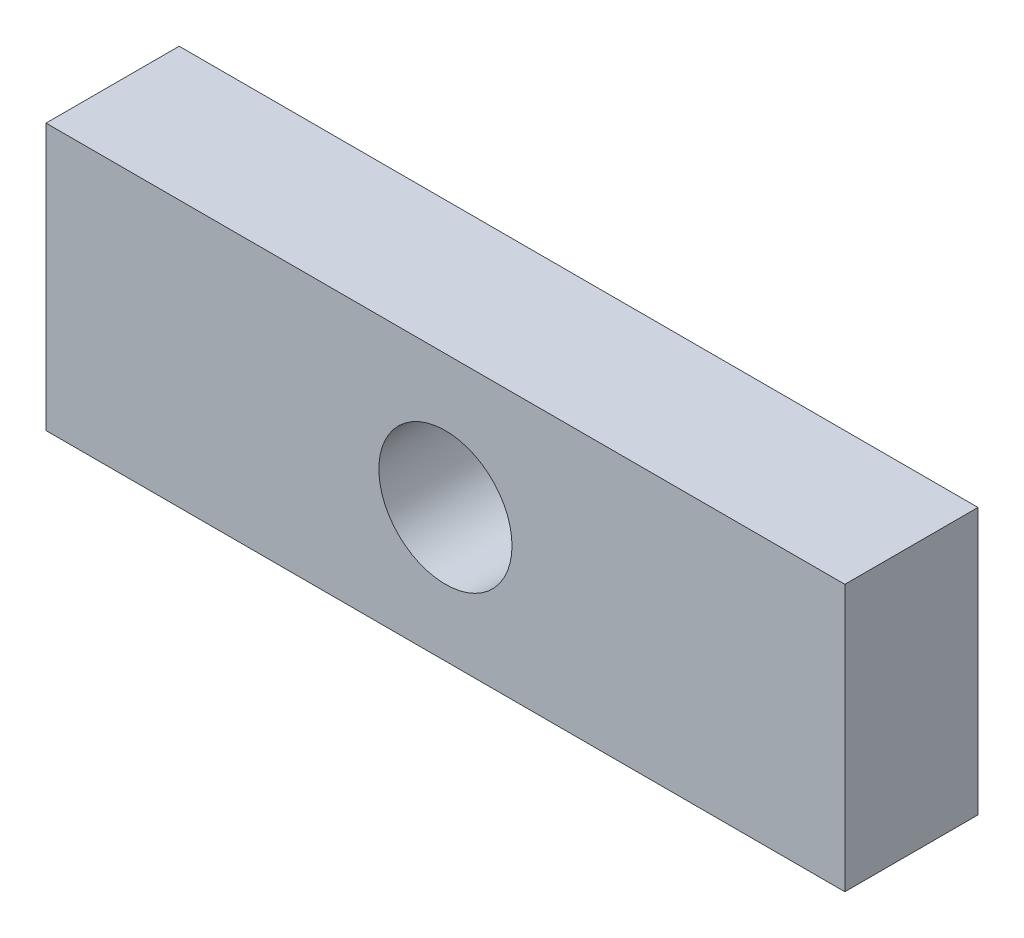
ISO-10303-21;
HEADER;
FILE_DESCRIPTION(('STEP AP214'),'2;1');
FILE_NAME('part.step','',(''),(''),'','','');
FILE_SCHEMA(('AUTOMOTIVE_DESIGN { 1 0 10303 214 1 1 1 1 }'));
ENDSEC;
DATA;
#1=APPLICATION_CONTEXT('core data for automotive mechanical design processes');
#2=APPLICATION_PROTOCOL_DEFINITION('international standard','automotive_design',2000,#1);
#3=PRODUCT_CONTEXT('',#1,'mechanical');
#4=PRODUCT('Part','Part','',(#3));
#5=PRODUCT_RELATED_PRODUCT_CATEGORY('part','',(#4));
#6=PRODUCT_DEFINITION_FORMATION('','',#4);
#7=PRODUCT_DEFINITION_CONTEXT('part definition',#1,'design');
#8=PRODUCT_DEFINITION('design','',#6,#7);
#9=PRODUCT_DEFINITION_SHAPE('','',#8);
#10=(LENGTH_UNIT() NAMED_UNIT(*) SI_UNIT(.MILLI.,.METRE.));
#11=(NAMED_UNIT(*) PLANE_ANGLE_UNIT() SI_UNIT($,.RADIAN.));
#12=(NAMED_UNIT(*) SI_UNIT($,.STERADIAN.) SOLID_ANGLE_UNIT());
#13=UNCERTAINTY_MEASURE_WITH_UNIT(LENGTH_MEASURE(1.E-05),#10,'distance_accuracy_value','');
#14=(GEOMETRIC_REPRESENTATION_CONTEXT(3) GLOBAL_UNCERTAINTY_ASSIGNED_CONTEXT((#13)) GLOBAL_UNIT_ASSIGNED_CONTEXT((#10,
#11,#12)) REPRESENTATION_CONTEXT('',''));
#15=CARTESIAN_POINT('',(0.,0.,0.));
#16=DIRECTION('',(0.,0.,1.));
#17=DIRECTION('',(1.,0.,0.));
#18=AXIS2_PLACEMENT_3D('',#15,#16,#17);
#19=CARTESIAN_POINT('',(0.,0.,10.));
#20=DIRECTION('',(0.,0.,1.));
#21=DIRECTION('',(1.,0.,0.));
#22=AXIS2_PLACEMENT_3D('',#19,#20,#21);
#23=PLANE('',#22);
#24=DIRECTION('',(0.,1.,0.));
#25=VECTOR('',#24,1.);
#26=CARTESIAN_POINT('',(30.,10.,10.));
#27=LINE('',#26,#25);
#28=CARTESIAN_POINT('',(30.,-10.,10.));
#29=VERTEX_POINT('',#28);
#30=CARTESIAN_POINT('',(30.,10.,10.));
#31=VERTEX_POINT('',#30);
#32=EDGE_CURVE('E85',#29,#31,#27,.T.);
#33=ORIENTED_EDGE('',*,*,#32,.T.);
#34=DIRECTION('',(-1.,0.,0.));
#35=VECTOR('',#34,1.);
#36=CARTESIAN_POINT('',(-30.,10.,10.));
#37=LINE('',#36,#35);
#38=CARTESIAN_POINT('',(-30.,10.,10.));
#39=VERTEX_POINT('',#38);
#40=EDGE_CURVE('E80',#31,#39,#37,.T.);
#41=ORIENTED_EDGE('',*,*,#40,.T.);
#42=DIRECTION('',(0.,-1.,0.));
#43=VECTOR('',#42,1.);
#44=CARTESIAN_POINT('',(-30.,10.,10.));
#45=LINE('',#44,#43);
#46=CARTESIAN_POINT('',(-30.,-10.,10.));
#47=VERTEX_POINT('',#46);
#48=EDGE_CURVE('E83',#39,#47,#45,.T.);
#49=ORIENTED_EDGE('',*,*,#48,.T.);
#50=DIRECTION('',(1.,0.,0.));
#51=VECTOR('',#50,1.);
#52=CARTESIAN_POINT('',(-30.,-10.,10.));
#53=LINE('',#52,#51);
#54=EDGE_CURVE('E50',#47,#29,#53,.T.);
#55=ORIENTED_EDGE('',*,*,#54,.T.);
#56=EDGE_LOOP('',(#33,#41,#49,#55));
#57=FACE_BOUND('',#56,.T.);
#58=CARTESIAN_POINT('',(0.,0.,10.));
#59=DIRECTION('',(0.,0.,1.));
#60=DIRECTION('',(1.,0.,0.));
#61=AXIS2_PLACEMENT_3D('',#58,#59,#60);
#62=CIRCLE('',#61,5.);
#63=CARTESIAN_POINT('',(5.,0.,10.));
#64=VERTEX_POINT('',#63);
#65=EDGE_CURVE('E100',#64,#64,#62,.T.);
#66=ORIENTED_EDGE('',*,*,#65,.F.);
#67=EDGE_LOOP('',(#66));
#68=FACE_BOUND('',#67,.T.);
#69=ADVANCED_FACE('F33',(#57,#68),#23,.T.);
#70=CARTESIAN_POINT('',(0.,0.,0.));
#71=DIRECTION('',(0.,0.,1.));
#72=DIRECTION('',(1.,0.,0.));
#73=AXIS2_PLACEMENT_3D('',#70,#71,#72);
#74=PLANE('',#73);
#75=DIRECTION('',(0.,1.,0.));
#76=VECTOR('',#75,1.);
#77=CARTESIAN_POINT('',(30.,10.,0.));
#78=LINE('',#77,#76);
#79=CARTESIAN_POINT('',(30.,-10.,0.));
#80=VERTEX_POINT('',#79);
#81=CARTESIAN_POINT('',(30.,10.,0.));
#82=VERTEX_POINT('',#81);
#83=EDGE_CURVE('E97',#80,#82,#78,.T.);
#84=ORIENTED_EDGE('',*,*,#83,.F.);
#85=DIRECTION('',(1.,0.,0.));
#86=VECTOR('',#85,1.);
#87=CARTESIAN_POINT('',(-30.,-10.,0.));
#88=LINE('',#87,#86);
#89=CARTESIAN_POINT('',(-30.,-10.,0.));
#90=VERTEX_POINT('',#89);
#91=EDGE_CURVE('E73',#90,#80,#88,.T.);
#92=ORIENTED_EDGE('',*,*,#91,.F.);
#93=DIRECTION('',(0.,-1.,0.));
#94=VECTOR('',#93,1.);
#95=CARTESIAN_POINT('',(-30.,10.,0.));
#96=LINE('',#95,#94);
#97=CARTESIAN_POINT('',(-30.,10.,0.));
#98=VERTEX_POINT('',#97);
#99=EDGE_CURVE('E67',#98,#90,#96,.T.);
#100=ORIENTED_EDGE('',*,*,#99,.F.);
#101=DIRECTION('',(-1.,0.,0.));
#102=VECTOR('',#101,1.);
#103=CARTESIAN_POINT('',(-30.,10.,0.));
#104=LINE('',#103,#102);
#105=EDGE_CURVE('E89',#82,#98,#104,.T.);
#106=ORIENTED_EDGE('',*,*,#105,.F.);
#107=EDGE_LOOP('',(#84,#92,#100,#106));
#108=FACE_BOUND('',#107,.T.);
#109=CARTESIAN_POINT('',(0.,0.,0.));
#110=DIRECTION('',(0.,0.,1.));
#111=DIRECTION('',(1.,0.,0.));
#112=AXIS2_PLACEMENT_3D('',#109,#110,#111);
#113=CIRCLE('',#112,5.);
#114=CARTESIAN_POINT('',(5.,0.,0.));
#115=VERTEX_POINT('',#114);
#116=EDGE_CURVE('E112',#115,#115,#113,.T.);
#117=ORIENTED_EDGE('',*,*,#116,.T.);
#118=EDGE_LOOP('',(#117));
#119=FACE_BOUND('',#118,.T.);
#120=ADVANCED_FACE('F108',(#108,#119),#74,.F.);
#121=CARTESIAN_POINT('',(30.,10.,10.));
#122=DIRECTION('',(-1.,0.,0.));
#123=DIRECTION('',(0.,0.,1.));
#124=AXIS2_PLACEMENT_3D('',#121,#122,#123);
#125=PLANE('',#124);
#126=ORIENTED_EDGE('',*,*,#83,.T.);
#127=DIRECTION('',(0.,0.,-1.));
#128=VECTOR('',#127,1.);
#129=CARTESIAN_POINT('',(30.,10.,10.));
#130=LINE('',#129,#128);
#131=EDGE_CURVE('E11',#31,#82,#130,.T.);
#132=ORIENTED_EDGE('',*,*,#131,.F.);
#133=ORIENTED_EDGE('',*,*,#32,.F.);
#134=DIRECTION('',(0.,0.,-1.));
#135=VECTOR('',#134,1.);
#136=CARTESIAN_POINT('',(30.,-10.,10.));
#137=LINE('',#136,#135);
#138=EDGE_CURVE('E93',#29,#80,#137,.T.);
#139=ORIENTED_EDGE('',*,*,#138,.T.);
#140=EDGE_LOOP('',(#126,#132,#133,#139));
#141=FACE_BOUND('',#140,.T.);
#142=ADVANCED_FACE('F35',(#141),#125,.F.);
#143=CARTESIAN_POINT('',(-30.,10.,10.));
#144=DIRECTION('',(0.,-1.,0.));
#145=DIRECTION('',(0.,0.,-1.));
#146=AXIS2_PLACEMENT_3D('',#143,#144,#145);
#147=PLANE('',#146);
#148=ORIENTED_EDGE('',*,*,#105,.T.);
#149=DIRECTION('',(0.,0.,-1.));
#150=VECTOR('',#149,1.);
#151=CARTESIAN_POINT('',(-30.,10.,10.));
#152=LINE('',#151,#150);
#153=EDGE_CURVE('E42',#39,#98,#152,.T.);
#154=ORIENTED_EDGE('',*,*,#153,.F.);
#155=ORIENTED_EDGE('',*,*,#40,.F.);
#156=ORIENTED_EDGE('',*,*,#131,.T.);
#157=EDGE_LOOP('',(#148,#154,#155,#156));
#158=FACE_BOUND('',#157,.T.);
#159=ADVANCED_FACE('F88',(#158),#147,.F.);
#160=CARTESIAN_POINT('',(-30.,10.,10.));
#161=DIRECTION('',(1.,0.,0.));
#162=DIRECTION('',(0.,0.,-1.));
#163=AXIS2_PLACEMENT_3D('',#160,#161,#162);
#164=PLANE('',#163);
#165=ORIENTED_EDGE('',*,*,#99,.T.);
#166=DIRECTION('',(0.,0.,-1.));
#167=VECTOR('',#166,1.);
#168=CARTESIAN_POINT('',(-30.,-10.,10.));
#169=LINE('',#168,#167);
#170=EDGE_CURVE('E90',#47,#90,#169,.T.);
#171=ORIENTED_EDGE('',*,*,#170,.F.);
#172=ORIENTED_EDGE('',*,*,#48,.F.);
#173=ORIENTED_EDGE('',*,*,#153,.T.);
#174=EDGE_LOOP('',(#165,#171,#172,#173));
#175=FACE_BOUND('',#174,.T.);
#176=ADVANCED_FACE('F91',(#175),#164,.F.);
#177=CARTESIAN_POINT('',(-30.,-10.,10.));
#178=DIRECTION('',(0.,1.,0.));
#179=DIRECTION('',(0.,0.,1.));
#180=AXIS2_PLACEMENT_3D('',#177,#178,#179);
#181=PLANE('',#180);
#182=ORIENTED_EDGE('',*,*,#91,.T.);
#183=ORIENTED_EDGE('',*,*,#138,.F.);
#184=ORIENTED_EDGE('',*,*,#54,.F.);
#185=ORIENTED_EDGE('',*,*,#170,.T.);
#186=EDGE_LOOP('',(#182,#183,#184,#185));
#187=FACE_BOUND('',#186,.T.);
#188=ADVANCED_FACE('F105',(#187),#181,.F.);
#189=CARTESIAN_POINT('',(0.,0.,10.));
#190=DIRECTION('',(0.,0.,-1.));
#191=DIRECTION('',(-1.,0.,0.));
#192=AXIS2_PLACEMENT_3D('',#189,#190,#191);
#193=CYLINDRICAL_SURFACE('',#192,5.);
#194=ORIENTED_EDGE('',*,*,#65,.T.);
#195=EDGE_LOOP('',(#194));
#196=FACE_BOUND('',#195,.T.);
#197=ORIENTED_EDGE('',*,*,#116,.F.);
#198=EDGE_LOOP('',(#197));
#199=FACE_BOUND('',#198,.T.);
#200=ADVANCED_FACE('F118',(#196,#199),#193,.F.);
#201=CLOSED_SHELL('',(#69,#120,#142,#159,#176,#188,#200));
#202=MANIFOLD_SOLID_BREP('B2',#201);
#203=ADVANCED_BREP_SHAPE_REPRESENTATION('',(#18,#202),#14);
#204=SHAPE_DEFINITION_REPRESENTATION(#9,#203);
ENDSEC;
END-ISO-10303-21;
